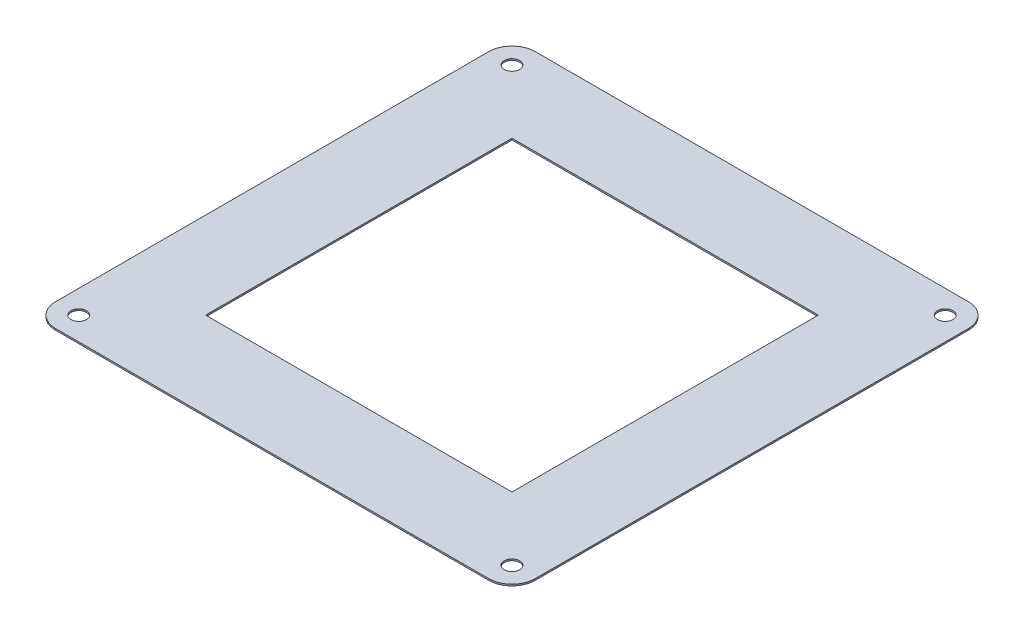
ISO-10303-21;
HEADER;
FILE_DESCRIPTION(('STEP AP214'),'2;1');
FILE_NAME('part.step','',(''),(''),'','','');
FILE_SCHEMA(('AUTOMOTIVE_DESIGN { 1 0 10303 214 1 1 1 1 }'));
ENDSEC;
DATA;
#1=APPLICATION_CONTEXT('core data for automotive mechanical design processes');
#2=APPLICATION_PROTOCOL_DEFINITION('international standard','automotive_design',2000,#1);
#3=PRODUCT_CONTEXT('',#1,'mechanical');
#4=PRODUCT('Part','Part','',(#3));
#5=PRODUCT_RELATED_PRODUCT_CATEGORY('part','',(#4));
#6=PRODUCT_DEFINITION_FORMATION('','',#4);
#7=PRODUCT_DEFINITION_CONTEXT('part definition',#1,'design');
#8=PRODUCT_DEFINITION('design','',#6,#7);
#9=PRODUCT_DEFINITION_SHAPE('','',#8);
#10=(LENGTH_UNIT() NAMED_UNIT(*) SI_UNIT(.MILLI.,.METRE.));
#11=(NAMED_UNIT(*) PLANE_ANGLE_UNIT() SI_UNIT($,.RADIAN.));
#12=(NAMED_UNIT(*) SI_UNIT($,.STERADIAN.) SOLID_ANGLE_UNIT());
#13=UNCERTAINTY_MEASURE_WITH_UNIT(LENGTH_MEASURE(1.E-05),#10,'distance_accuracy_value','');
#14=(GEOMETRIC_REPRESENTATION_CONTEXT(3) GLOBAL_UNCERTAINTY_ASSIGNED_CONTEXT((#13)) GLOBAL_UNIT_ASSIGNED_CONTEXT((#10,
#11,#12)) REPRESENTATION_CONTEXT('',''));
#15=CARTESIAN_POINT('',(0.,0.,0.));
#16=DIRECTION('',(0.,0.,1.));
#17=DIRECTION('',(1.,0.,0.));
#18=AXIS2_PLACEMENT_3D('',#15,#16,#17);
#19=CARTESIAN_POINT('',(17.5,0.5,-157.5));
#20=DIRECTION('',(0.,1.,0.));
#21=DIRECTION('',(0.,0.,1.));
#22=AXIS2_PLACEMENT_3D('',#19,#20,#21);
#23=PLANE('',#22);
#24=DIRECTION('',(0.,0.,-1.));
#25=VECTOR('',#24,1.);
#26=CARTESIAN_POINT('',(137.,0.5,-38.));
#27=LINE('',#26,#25);
#28=CARTESIAN_POINT('',(137.,0.5,-38.));
#29=VERTEX_POINT('',#28);
#30=CARTESIAN_POINT('',(137.,0.5,-137.));
#31=VERTEX_POINT('',#30);
#32=EDGE_CURVE('E47',#29,#31,#27,.T.);
#33=ORIENTED_EDGE('',*,*,#32,.F.);
#34=DIRECTION('',(1.,0.,0.));
#35=VECTOR('',#34,1.);
#36=CARTESIAN_POINT('',(38.,0.5,-38.));
#37=LINE('',#36,#35);
#38=CARTESIAN_POINT('',(38.,0.5,-38.));
#39=VERTEX_POINT('',#38);
#40=EDGE_CURVE('E139',#39,#29,#37,.T.);
#41=ORIENTED_EDGE('',*,*,#40,.F.);
#42=DIRECTION('',(0.,0.,1.));
#43=VECTOR('',#42,1.);
#44=CARTESIAN_POINT('',(38.,0.5,-38.));
#45=LINE('',#44,#43);
#46=CARTESIAN_POINT('',(38.,0.5,-137.));
#47=VERTEX_POINT('',#46);
#48=EDGE_CURVE('E124',#47,#39,#45,.T.);
#49=ORIENTED_EDGE('',*,*,#48,.F.);
#50=DIRECTION('',(-1.,0.,0.));
#51=VECTOR('',#50,1.);
#52=CARTESIAN_POINT('',(38.,0.5,-137.));
#53=LINE('',#52,#51);
#54=EDGE_CURVE('E133',#31,#47,#53,.T.);
#55=ORIENTED_EDGE('',*,*,#54,.F.);
#56=EDGE_LOOP('',(#33,#41,#49,#55));
#57=FACE_BOUND('',#56,.T.);
#58=CARTESIAN_POINT('',(157.5,0.5,-17.5));
#59=DIRECTION('',(0.,1.,0.));
#60=DIRECTION('',(0.,0.,1.));
#61=AXIS2_PLACEMENT_3D('',#58,#59,#60);
#62=CIRCLE('',#61,2.5);
#63=CARTESIAN_POINT('',(157.5,0.5,-15.));
#64=VERTEX_POINT('',#63);
#65=EDGE_CURVE('E155',#64,#64,#62,.T.);
#66=ORIENTED_EDGE('',*,*,#65,.F.);
#67=EDGE_LOOP('',(#66));
#68=FACE_BOUND('',#67,.T.);
#69=CARTESIAN_POINT('',(17.5,0.5,-157.5));
#70=DIRECTION('',(0.,1.,0.));
#71=DIRECTION('',(0.,0.,1.));
#72=AXIS2_PLACEMENT_3D('',#69,#70,#71);
#73=CIRCLE('',#72,2.5);
#74=CARTESIAN_POINT('',(17.5,0.5,-155.));
#75=VERTEX_POINT('',#74);
#76=EDGE_CURVE('E167',#75,#75,#73,.T.);
#77=ORIENTED_EDGE('',*,*,#76,.F.);
#78=EDGE_LOOP('',(#77));
#79=FACE_BOUND('',#78,.T.);
#80=CARTESIAN_POINT('',(17.5,0.5,-157.5));
#81=DIRECTION('',(0.,1.,0.));
#82=DIRECTION('',(0.,0.,1.));
#83=AXIS2_PLACEMENT_3D('',#80,#81,#82);
#84=CIRCLE('',#83,7.5);
#85=CARTESIAN_POINT('',(17.5,0.5,-165.));
#86=VERTEX_POINT('',#85);
#87=CARTESIAN_POINT('',(10.,0.5,-157.5));
#88=VERTEX_POINT('',#87);
#89=EDGE_CURVE('E173',#86,#88,#84,.T.);
#90=ORIENTED_EDGE('',*,*,#89,.T.);
#91=DIRECTION('',(0.,0.,1.));
#92=VECTOR('',#91,1.);
#93=CARTESIAN_POINT('',(10.,0.5,-17.5));
#94=LINE('',#93,#92);
#95=CARTESIAN_POINT('',(10.,0.5,-17.5));
#96=VERTEX_POINT('',#95);
#97=EDGE_CURVE('E176',#88,#96,#94,.T.);
#98=ORIENTED_EDGE('',*,*,#97,.T.);
#99=CARTESIAN_POINT('',(17.5,0.5,-17.5));
#100=DIRECTION('',(0.,1.,0.));
#101=DIRECTION('',(0.,0.,1.));
#102=AXIS2_PLACEMENT_3D('',#99,#100,#101);
#103=CIRCLE('',#102,7.5);
#104=CARTESIAN_POINT('',(17.5,0.5,-10.));
#105=VERTEX_POINT('',#104);
#106=EDGE_CURVE('E179',#96,#105,#103,.T.);
#107=ORIENTED_EDGE('',*,*,#106,.T.);
#108=DIRECTION('',(1.,0.,0.));
#109=VECTOR('',#108,1.);
#110=CARTESIAN_POINT('',(17.5,0.5,-10.));
#111=LINE('',#110,#109);
#112=CARTESIAN_POINT('',(157.5,0.5,-9.99999999999999));
#113=VERTEX_POINT('',#112);
#114=EDGE_CURVE('E181',#105,#113,#111,.T.);
#115=ORIENTED_EDGE('',*,*,#114,.T.);
#116=CARTESIAN_POINT('',(157.5,0.5,-17.5));
#117=DIRECTION('',(0.,1.,0.));
#118=DIRECTION('',(0.,0.,1.));
#119=AXIS2_PLACEMENT_3D('',#116,#117,#118);
#120=CIRCLE('',#119,7.50000000000002);
#121=CARTESIAN_POINT('',(165.,0.5,-17.5));
#122=VERTEX_POINT('',#121);
#123=EDGE_CURVE('E183',#113,#122,#120,.T.);
#124=ORIENTED_EDGE('',*,*,#123,.T.);
#125=DIRECTION('',(0.,0.,-1.));
#126=VECTOR('',#125,1.);
#127=CARTESIAN_POINT('',(165.,0.5,-17.5));
#128=LINE('',#127,#126);
#129=CARTESIAN_POINT('',(165.,0.5,-157.5));
#130=VERTEX_POINT('',#129);
#131=EDGE_CURVE('E185',#122,#130,#128,.T.);
#132=ORIENTED_EDGE('',*,*,#131,.T.);
#133=CARTESIAN_POINT('',(157.5,0.5,-157.5));
#134=DIRECTION('',(0.,1.,0.));
#135=DIRECTION('',(0.,0.,1.));
#136=AXIS2_PLACEMENT_3D('',#133,#134,#135);
#137=CIRCLE('',#136,7.50000000000001);
#138=CARTESIAN_POINT('',(157.5,0.5,-165.));
#139=VERTEX_POINT('',#138);
#140=EDGE_CURVE('E187',#130,#139,#137,.T.);
#141=ORIENTED_EDGE('',*,*,#140,.T.);
#142=DIRECTION('',(-1.,0.,0.));
#143=VECTOR('',#142,1.);
#144=CARTESIAN_POINT('',(17.5,0.5,-165.));
#145=LINE('',#144,#143);
#146=EDGE_CURVE('E189',#139,#86,#145,.T.);
#147=ORIENTED_EDGE('',*,*,#146,.T.);
#148=EDGE_LOOP('',(#90,#98,#107,#115,#124,#132,#141,#147));
#149=FACE_BOUND('',#148,.T.);
#150=CARTESIAN_POINT('',(157.5,0.5,-157.5));
#151=DIRECTION('',(0.,1.,0.));
#152=DIRECTION('',(0.,0.,1.));
#153=AXIS2_PLACEMENT_3D('',#150,#151,#152);
#154=CIRCLE('',#153,2.5);
#155=CARTESIAN_POINT('',(157.5,0.5,-155.));
#156=VERTEX_POINT('',#155);
#157=EDGE_CURVE('E161',#156,#156,#154,.T.);
#158=ORIENTED_EDGE('',*,*,#157,.F.);
#159=EDGE_LOOP('',(#158));
#160=FACE_BOUND('',#159,.T.);
#161=CARTESIAN_POINT('',(17.5,0.5,-17.5));
#162=DIRECTION('',(0.,1.,0.));
#163=DIRECTION('',(0.,0.,1.));
#164=AXIS2_PLACEMENT_3D('',#161,#162,#163);
#165=CIRCLE('',#164,2.5);
#166=CARTESIAN_POINT('',(17.5,0.5,-15.));
#167=VERTEX_POINT('',#166);
#168=EDGE_CURVE('E149',#167,#167,#165,.T.);
#169=ORIENTED_EDGE('',*,*,#168,.F.);
#170=EDGE_LOOP('',(#169));
#171=FACE_BOUND('',#170,.T.);
#172=ADVANCED_FACE('F32',(#57,#68,#79,#149,#160,#171),#23,.T.);
#173=CARTESIAN_POINT('',(17.5,0.,-157.5));
#174=DIRECTION('',(0.,1.,0.));
#175=DIRECTION('',(0.,0.,1.));
#176=AXIS2_PLACEMENT_3D('',#173,#174,#175);
#177=PLANE('',#176);
#178=DIRECTION('',(1.,0.,0.));
#179=VECTOR('',#178,1.);
#180=CARTESIAN_POINT('',(17.5,0.,-38.));
#181=LINE('',#180,#179);
#182=CARTESIAN_POINT('',(38.,0.,-38.));
#183=VERTEX_POINT('',#182);
#184=CARTESIAN_POINT('',(137.,0.,-38.));
#185=VERTEX_POINT('',#184);
#186=EDGE_CURVE('E40',#183,#185,#181,.T.);
#187=ORIENTED_EDGE('',*,*,#186,.T.);
#188=DIRECTION('',(0.,0.,-1.));
#189=VECTOR('',#188,1.);
#190=CARTESIAN_POINT('',(137.,0.,-157.5));
#191=LINE('',#190,#189);
#192=CARTESIAN_POINT('',(137.,0.,-137.));
#193=VERTEX_POINT('',#192);
#194=EDGE_CURVE('E11',#185,#193,#191,.T.);
#195=ORIENTED_EDGE('',*,*,#194,.T.);
#196=DIRECTION('',(-1.,0.,0.));
#197=VECTOR('',#196,1.);
#198=CARTESIAN_POINT('',(17.5,0.,-137.));
#199=LINE('',#198,#197);
#200=CARTESIAN_POINT('',(38.,0.,-137.));
#201=VERTEX_POINT('',#200);
#202=EDGE_CURVE('E230',#193,#201,#199,.T.);
#203=ORIENTED_EDGE('',*,*,#202,.T.);
#204=DIRECTION('',(0.,0.,1.));
#205=VECTOR('',#204,1.);
#206=CARTESIAN_POINT('',(38.,0.,-157.5));
#207=LINE('',#206,#205);
#208=EDGE_CURVE('E127',#201,#183,#207,.T.);
#209=ORIENTED_EDGE('',*,*,#208,.T.);
#210=EDGE_LOOP('',(#187,#195,#203,#209));
#211=FACE_BOUND('',#210,.T.);
#212=CARTESIAN_POINT('',(17.5,0.,-157.5));
#213=DIRECTION('',(0.,1.,0.));
#214=DIRECTION('',(0.,0.,1.));
#215=AXIS2_PLACEMENT_3D('',#212,#213,#214);
#216=CIRCLE('',#215,7.5);
#217=CARTESIAN_POINT('',(17.5,0.,-165.));
#218=VERTEX_POINT('',#217);
#219=CARTESIAN_POINT('',(10.,0.,-157.5));
#220=VERTEX_POINT('',#219);
#221=EDGE_CURVE('E170',#218,#220,#216,.T.);
#222=ORIENTED_EDGE('',*,*,#221,.F.);
#223=DIRECTION('',(-1.,0.,0.));
#224=VECTOR('',#223,1.);
#225=CARTESIAN_POINT('',(17.5,0.,-165.));
#226=LINE('',#225,#224);
#227=CARTESIAN_POINT('',(157.5,0.,-165.));
#228=VERTEX_POINT('',#227);
#229=EDGE_CURVE('E177',#228,#218,#226,.T.);
#230=ORIENTED_EDGE('',*,*,#229,.F.);
#231=CARTESIAN_POINT('',(157.5,0.,-157.5));
#232=DIRECTION('',(0.,1.,0.));
#233=DIRECTION('',(0.,0.,1.));
#234=AXIS2_PLACEMENT_3D('',#231,#232,#233);
#235=CIRCLE('',#234,7.50000000000001);
#236=CARTESIAN_POINT('',(165.,0.,-157.5));
#237=VERTEX_POINT('',#236);
#238=EDGE_CURVE('E204',#237,#228,#235,.T.);
#239=ORIENTED_EDGE('',*,*,#238,.F.);
#240=DIRECTION('',(0.,0.,-1.));
#241=VECTOR('',#240,1.);
#242=CARTESIAN_POINT('',(165.,0.,-17.5));
#243=LINE('',#242,#241);
#244=CARTESIAN_POINT('',(165.,0.,-17.5));
#245=VERTEX_POINT('',#244);
#246=EDGE_CURVE('E202',#245,#237,#243,.T.);
#247=ORIENTED_EDGE('',*,*,#246,.F.);
#248=CARTESIAN_POINT('',(157.5,0.,-17.5));
#249=DIRECTION('',(0.,1.,0.));
#250=DIRECTION('',(0.,0.,1.));
#251=AXIS2_PLACEMENT_3D('',#248,#249,#250);
#252=CIRCLE('',#251,7.50000000000002);
#253=CARTESIAN_POINT('',(157.5,0.,-9.99999999999999));
#254=VERTEX_POINT('',#253);
#255=EDGE_CURVE('E200',#254,#245,#252,.T.);
#256=ORIENTED_EDGE('',*,*,#255,.F.);
#257=DIRECTION('',(1.,0.,0.));
#258=VECTOR('',#257,1.);
#259=CARTESIAN_POINT('',(17.5,0.,-10.));
#260=LINE('',#259,#258);
#261=CARTESIAN_POINT('',(17.5,0.,-10.));
#262=VERTEX_POINT('',#261);
#263=EDGE_CURVE('E198',#262,#254,#260,.T.);
#264=ORIENTED_EDGE('',*,*,#263,.F.);
#265=CARTESIAN_POINT('',(17.5,0.,-17.5));
#266=DIRECTION('',(0.,1.,0.));
#267=DIRECTION('',(0.,0.,1.));
#268=AXIS2_PLACEMENT_3D('',#265,#266,#267);
#269=CIRCLE('',#268,7.5);
#270=CARTESIAN_POINT('',(10.,0.,-17.5));
#271=VERTEX_POINT('',#270);
#272=EDGE_CURVE('E196',#271,#262,#269,.T.);
#273=ORIENTED_EDGE('',*,*,#272,.F.);
#274=DIRECTION('',(0.,0.,1.));
#275=VECTOR('',#274,1.);
#276=CARTESIAN_POINT('',(10.,0.,-17.5));
#277=LINE('',#276,#275);
#278=EDGE_CURVE('E194',#220,#271,#277,.T.);
#279=ORIENTED_EDGE('',*,*,#278,.F.);
#280=EDGE_LOOP('',(#222,#230,#239,#247,#256,#264,#273,#279));
#281=FACE_BOUND('',#280,.T.);
#282=CARTESIAN_POINT('',(17.5,0.,-157.5));
#283=DIRECTION('',(0.,1.,0.));
#284=DIRECTION('',(0.,0.,1.));
#285=AXIS2_PLACEMENT_3D('',#282,#283,#284);
#286=CIRCLE('',#285,2.5);
#287=CARTESIAN_POINT('',(17.5,0.,-155.));
#288=VERTEX_POINT('',#287);
#289=EDGE_CURVE('E164',#288,#288,#286,.T.);
#290=ORIENTED_EDGE('',*,*,#289,.T.);
#291=EDGE_LOOP('',(#290));
#292=FACE_BOUND('',#291,.T.);
#293=CARTESIAN_POINT('',(157.5,0.,-157.5));
#294=DIRECTION('',(0.,1.,0.));
#295=DIRECTION('',(0.,0.,1.));
#296=AXIS2_PLACEMENT_3D('',#293,#294,#295);
#297=CIRCLE('',#296,2.5);
#298=CARTESIAN_POINT('',(157.5,0.,-155.));
#299=VERTEX_POINT('',#298);
#300=EDGE_CURVE('E158',#299,#299,#297,.T.);
#301=ORIENTED_EDGE('',*,*,#300,.T.);
#302=EDGE_LOOP('',(#301));
#303=FACE_BOUND('',#302,.T.);
#304=CARTESIAN_POINT('',(157.5,0.,-17.5));
#305=DIRECTION('',(0.,1.,0.));
#306=DIRECTION('',(0.,0.,1.));
#307=AXIS2_PLACEMENT_3D('',#304,#305,#306);
#308=CIRCLE('',#307,2.5);
#309=CARTESIAN_POINT('',(157.5,0.,-15.));
#310=VERTEX_POINT('',#309);
#311=EDGE_CURVE('E152',#310,#310,#308,.T.);
#312=ORIENTED_EDGE('',*,*,#311,.T.);
#313=EDGE_LOOP('',(#312));
#314=FACE_BOUND('',#313,.T.);
#315=CARTESIAN_POINT('',(17.5,0.,-17.5));
#316=DIRECTION('',(0.,1.,0.));
#317=DIRECTION('',(0.,0.,1.));
#318=AXIS2_PLACEMENT_3D('',#315,#316,#317);
#319=CIRCLE('',#318,2.5);
#320=CARTESIAN_POINT('',(17.5,0.,-15.));
#321=VERTEX_POINT('',#320);
#322=EDGE_CURVE('E146',#321,#321,#319,.T.);
#323=ORIENTED_EDGE('',*,*,#322,.T.);
#324=EDGE_LOOP('',(#323));
#325=FACE_BOUND('',#324,.T.);
#326=ADVANCED_FACE('F234',(#211,#281,#292,#303,#314,#325),#177,.F.);
#327=CARTESIAN_POINT('',(17.5,0.5,-157.5));
#328=DIRECTION('',(0.,-1.,0.));
#329=DIRECTION('',(0.,0.,-1.));
#330=AXIS2_PLACEMENT_3D('',#327,#328,#329);
#331=CYLINDRICAL_SURFACE('',#330,7.5);
#332=ORIENTED_EDGE('',*,*,#221,.T.);
#333=DIRECTION('',(0.,-1.,0.));
#334=VECTOR('',#333,1.);
#335=CARTESIAN_POINT('',(10.,0.5,-157.5));
#336=LINE('',#335,#334);
#337=EDGE_CURVE('E227',#88,#220,#336,.T.);
#338=ORIENTED_EDGE('',*,*,#337,.F.);
#339=ORIENTED_EDGE('',*,*,#89,.F.);
#340=DIRECTION('',(0.,-1.,0.));
#341=VECTOR('',#340,1.);
#342=CARTESIAN_POINT('',(17.5,0.5,-165.));
#343=LINE('',#342,#341);
#344=EDGE_CURVE('E191',#86,#218,#343,.T.);
#345=ORIENTED_EDGE('',*,*,#344,.T.);
#346=EDGE_LOOP('',(#332,#338,#339,#345));
#347=FACE_BOUND('',#346,.T.);
#348=ADVANCED_FACE('F34',(#347),#331,.T.);
#349=CARTESIAN_POINT('',(10.,0.5,-17.5));
#350=DIRECTION('',(1.,0.,0.));
#351=DIRECTION('',(0.,0.,-1.));
#352=AXIS2_PLACEMENT_3D('',#349,#350,#351);
#353=PLANE('',#352);
#354=ORIENTED_EDGE('',*,*,#278,.T.);
#355=DIRECTION('',(0.,-1.,0.));
#356=VECTOR('',#355,1.);
#357=CARTESIAN_POINT('',(10.,0.5,-17.5));
#358=LINE('',#357,#356);
#359=EDGE_CURVE('E224',#96,#271,#358,.T.);
#360=ORIENTED_EDGE('',*,*,#359,.F.);
#361=ORIENTED_EDGE('',*,*,#97,.F.);
#362=ORIENTED_EDGE('',*,*,#337,.T.);
#363=EDGE_LOOP('',(#354,#360,#361,#362));
#364=FACE_BOUND('',#363,.T.);
#365=ADVANCED_FACE('F284',(#364),#353,.F.);
#366=CARTESIAN_POINT('',(17.5,0.5,-17.5));
#367=DIRECTION('',(0.,-1.,0.));
#368=DIRECTION('',(0.,0.,-1.));
#369=AXIS2_PLACEMENT_3D('',#366,#367,#368);
#370=CYLINDRICAL_SURFACE('',#369,7.5);
#371=ORIENTED_EDGE('',*,*,#272,.T.);
#372=DIRECTION('',(0.,-1.,0.));
#373=VECTOR('',#372,1.);
#374=CARTESIAN_POINT('',(17.5,0.5,-10.));
#375=LINE('',#374,#373);
#376=EDGE_CURVE('E221',#105,#262,#375,.T.);
#377=ORIENTED_EDGE('',*,*,#376,.F.);
#378=ORIENTED_EDGE('',*,*,#106,.F.);
#379=ORIENTED_EDGE('',*,*,#359,.T.);
#380=EDGE_LOOP('',(#371,#377,#378,#379));
#381=FACE_BOUND('',#380,.T.);
#382=ADVANCED_FACE('F281',(#381),#370,.T.);
#383=CARTESIAN_POINT('',(17.5,0.5,-10.));
#384=DIRECTION('',(0.,0.,-1.));
#385=DIRECTION('',(-1.,0.,0.));
#386=AXIS2_PLACEMENT_3D('',#383,#384,#385);
#387=PLANE('',#386);
#388=ORIENTED_EDGE('',*,*,#263,.T.);
#389=DIRECTION('',(0.,-1.,0.));
#390=VECTOR('',#389,1.);
#391=CARTESIAN_POINT('',(157.5,0.5,-9.99999999999999));
#392=LINE('',#391,#390);
#393=EDGE_CURVE('E218',#113,#254,#392,.T.);
#394=ORIENTED_EDGE('',*,*,#393,.F.);
#395=ORIENTED_EDGE('',*,*,#114,.F.);
#396=ORIENTED_EDGE('',*,*,#376,.T.);
#397=EDGE_LOOP('',(#388,#394,#395,#396));
#398=FACE_BOUND('',#397,.T.);
#399=ADVANCED_FACE('F277',(#398),#387,.F.);
#400=CARTESIAN_POINT('',(157.5,0.5,-17.5));
#401=DIRECTION('',(0.,-1.,0.));
#402=DIRECTION('',(0.,0.,-1.));
#403=AXIS2_PLACEMENT_3D('',#400,#401,#402);
#404=CYLINDRICAL_SURFACE('',#403,7.50000000000002);
#405=ORIENTED_EDGE('',*,*,#255,.T.);
#406=DIRECTION('',(0.,-1.,0.));
#407=VECTOR('',#406,1.);
#408=CARTESIAN_POINT('',(165.,0.5,-17.5));
#409=LINE('',#408,#407);
#410=EDGE_CURVE('E215',#122,#245,#409,.T.);
#411=ORIENTED_EDGE('',*,*,#410,.F.);
#412=ORIENTED_EDGE('',*,*,#123,.F.);
#413=ORIENTED_EDGE('',*,*,#393,.T.);
#414=EDGE_LOOP('',(#405,#411,#412,#413));
#415=FACE_BOUND('',#414,.T.);
#416=ADVANCED_FACE('F273',(#415),#404,.T.);
#417=CARTESIAN_POINT('',(165.,0.5,-17.5));
#418=DIRECTION('',(-1.,0.,0.));
#419=DIRECTION('',(0.,0.,1.));
#420=AXIS2_PLACEMENT_3D('',#417,#418,#419);
#421=PLANE('',#420);
#422=ORIENTED_EDGE('',*,*,#246,.T.);
#423=DIRECTION('',(0.,-1.,0.));
#424=VECTOR('',#423,1.);
#425=CARTESIAN_POINT('',(165.,0.5,-157.5));
#426=LINE('',#425,#424);
#427=EDGE_CURVE('E212',#130,#237,#426,.T.);
#428=ORIENTED_EDGE('',*,*,#427,.F.);
#429=ORIENTED_EDGE('',*,*,#131,.F.);
#430=ORIENTED_EDGE('',*,*,#410,.T.);
#431=EDGE_LOOP('',(#422,#428,#429,#430));
#432=FACE_BOUND('',#431,.T.);
#433=ADVANCED_FACE('F269',(#432),#421,.F.);
#434=CARTESIAN_POINT('',(157.5,0.5,-157.5));
#435=DIRECTION('',(0.,-1.,0.));
#436=DIRECTION('',(0.,0.,-1.));
#437=AXIS2_PLACEMENT_3D('',#434,#435,#436);
#438=CYLINDRICAL_SURFACE('',#437,7.50000000000001);
#439=ORIENTED_EDGE('',*,*,#238,.T.);
#440=DIRECTION('',(0.,-1.,0.));
#441=VECTOR('',#440,1.);
#442=CARTESIAN_POINT('',(157.5,0.5,-165.));
#443=LINE('',#442,#441);
#444=EDGE_CURVE('E209',#139,#228,#443,.T.);
#445=ORIENTED_EDGE('',*,*,#444,.F.);
#446=ORIENTED_EDGE('',*,*,#140,.F.);
#447=ORIENTED_EDGE('',*,*,#427,.T.);
#448=EDGE_LOOP('',(#439,#445,#446,#447));
#449=FACE_BOUND('',#448,.T.);
#450=ADVANCED_FACE('F265',(#449),#438,.T.);
#451=CARTESIAN_POINT('',(17.5,0.5,-165.));
#452=DIRECTION('',(0.,0.,1.));
#453=DIRECTION('',(1.,0.,0.));
#454=AXIS2_PLACEMENT_3D('',#451,#452,#453);
#455=PLANE('',#454);
#456=ORIENTED_EDGE('',*,*,#229,.T.);
#457=ORIENTED_EDGE('',*,*,#344,.F.);
#458=ORIENTED_EDGE('',*,*,#146,.F.);
#459=ORIENTED_EDGE('',*,*,#444,.T.);
#460=EDGE_LOOP('',(#456,#457,#458,#459));
#461=FACE_BOUND('',#460,.T.);
#462=ADVANCED_FACE('F262',(#461),#455,.F.);
#463=CARTESIAN_POINT('',(17.5,0.5,-157.5));
#464=DIRECTION('',(0.,-1.,0.));
#465=DIRECTION('',(0.,0.,-1.));
#466=AXIS2_PLACEMENT_3D('',#463,#464,#465);
#467=CYLINDRICAL_SURFACE('',#466,2.5);
#468=ORIENTED_EDGE('',*,*,#76,.T.);
#469=EDGE_LOOP('',(#468));
#470=FACE_BOUND('',#469,.T.);
#471=ORIENTED_EDGE('',*,*,#289,.F.);
#472=EDGE_LOOP('',(#471));
#473=FACE_BOUND('',#472,.T.);
#474=ADVANCED_FACE('F259',(#470,#473),#467,.F.);
#475=CARTESIAN_POINT('',(157.5,0.5,-157.5));
#476=DIRECTION('',(0.,-1.,0.));
#477=DIRECTION('',(0.,0.,-1.));
#478=AXIS2_PLACEMENT_3D('',#475,#476,#477);
#479=CYLINDRICAL_SURFACE('',#478,2.5);
#480=ORIENTED_EDGE('',*,*,#157,.T.);
#481=EDGE_LOOP('',(#480));
#482=FACE_BOUND('',#481,.T.);
#483=ORIENTED_EDGE('',*,*,#300,.F.);
#484=EDGE_LOOP('',(#483));
#485=FACE_BOUND('',#484,.T.);
#486=ADVANCED_FACE('F324',(#482,#485),#479,.F.);
#487=CARTESIAN_POINT('',(157.5,0.5,-17.5));
#488=DIRECTION('',(0.,-1.,0.));
#489=DIRECTION('',(0.,0.,-1.));
#490=AXIS2_PLACEMENT_3D('',#487,#488,#489);
#491=CYLINDRICAL_SURFACE('',#490,2.5);
#492=ORIENTED_EDGE('',*,*,#65,.T.);
#493=EDGE_LOOP('',(#492));
#494=FACE_BOUND('',#493,.T.);
#495=ORIENTED_EDGE('',*,*,#311,.F.);
#496=EDGE_LOOP('',(#495));
#497=FACE_BOUND('',#496,.T.);
#498=ADVANCED_FACE('F248',(#494,#497),#491,.F.);
#499=CARTESIAN_POINT('',(17.5,0.5,-17.5));
#500=DIRECTION('',(0.,-1.,0.));
#501=DIRECTION('',(0.,0.,-1.));
#502=AXIS2_PLACEMENT_3D('',#499,#500,#501);
#503=CYLINDRICAL_SURFACE('',#502,2.5);
#504=ORIENTED_EDGE('',*,*,#168,.T.);
#505=EDGE_LOOP('',(#504));
#506=FACE_BOUND('',#505,.T.);
#507=ORIENTED_EDGE('',*,*,#322,.F.);
#508=EDGE_LOOP('',(#507));
#509=FACE_BOUND('',#508,.T.);
#510=ADVANCED_FACE('F241',(#506,#509),#503,.F.);
#511=CARTESIAN_POINT('',(137.,-9.5,-38.));
#512=DIRECTION('',(1.,0.,0.));
#513=DIRECTION('',(0.,0.,-1.));
#514=AXIS2_PLACEMENT_3D('',#511,#512,#513);
#515=PLANE('',#514);
#516=DIRECTION('',(0.,1.,0.));
#517=VECTOR('',#516,1.);
#518=CARTESIAN_POINT('',(137.,-9.5,-38.));
#519=LINE('',#518,#517);
#520=EDGE_CURVE('E144',#185,#29,#519,.T.);
#521=ORIENTED_EDGE('',*,*,#520,.T.);
#522=ORIENTED_EDGE('',*,*,#32,.T.);
#523=DIRECTION('',(0.,1.,0.));
#524=VECTOR('',#523,1.);
#525=CARTESIAN_POINT('',(137.,-9.5,-137.));
#526=LINE('',#525,#524);
#527=EDGE_CURVE('E130',#193,#31,#526,.T.);
#528=ORIENTED_EDGE('',*,*,#527,.F.);
#529=ORIENTED_EDGE('',*,*,#194,.F.);
#530=EDGE_LOOP('',(#521,#522,#528,#529));
#531=FACE_BOUND('',#530,.T.);
#532=ADVANCED_FACE('F239',(#531),#515,.F.);
#533=CARTESIAN_POINT('',(38.,-9.5,-38.));
#534=DIRECTION('',(0.,0.,1.));
#535=DIRECTION('',(1.,0.,0.));
#536=AXIS2_PLACEMENT_3D('',#533,#534,#535);
#537=PLANE('',#536);
#538=DIRECTION('',(0.,1.,0.));
#539=VECTOR('',#538,1.);
#540=CARTESIAN_POINT('',(38.,-9.5,-38.));
#541=LINE('',#540,#539);
#542=EDGE_CURVE('E129',#183,#39,#541,.T.);
#543=ORIENTED_EDGE('',*,*,#542,.T.);
#544=ORIENTED_EDGE('',*,*,#40,.T.);
#545=ORIENTED_EDGE('',*,*,#520,.F.);
#546=ORIENTED_EDGE('',*,*,#186,.F.);
#547=EDGE_LOOP('',(#543,#544,#545,#546));
#548=FACE_BOUND('',#547,.T.);
#549=ADVANCED_FACE('F238',(#548),#537,.F.);
#550=CARTESIAN_POINT('',(38.,-9.5,-38.));
#551=DIRECTION('',(-1.,0.,0.));
#552=DIRECTION('',(0.,0.,1.));
#553=AXIS2_PLACEMENT_3D('',#550,#551,#552);
#554=PLANE('',#553);
#555=DIRECTION('',(0.,1.,0.));
#556=VECTOR('',#555,1.);
#557=CARTESIAN_POINT('',(38.,-9.5,-137.));
#558=LINE('',#557,#556);
#559=EDGE_CURVE('E55',#201,#47,#558,.T.);
#560=ORIENTED_EDGE('',*,*,#559,.T.);
#561=ORIENTED_EDGE('',*,*,#48,.T.);
#562=ORIENTED_EDGE('',*,*,#542,.F.);
#563=ORIENTED_EDGE('',*,*,#208,.F.);
#564=EDGE_LOOP('',(#560,#561,#562,#563));
#565=FACE_BOUND('',#564,.T.);
#566=ADVANCED_FACE('F121',(#565),#554,.F.);
#567=CARTESIAN_POINT('',(38.,-9.5,-137.));
#568=DIRECTION('',(0.,0.,-1.));
#569=DIRECTION('',(-1.,0.,0.));
#570=AXIS2_PLACEMENT_3D('',#567,#568,#569);
#571=PLANE('',#570);
#572=ORIENTED_EDGE('',*,*,#527,.T.);
#573=ORIENTED_EDGE('',*,*,#54,.T.);
#574=ORIENTED_EDGE('',*,*,#559,.F.);
#575=ORIENTED_EDGE('',*,*,#202,.F.);
#576=EDGE_LOOP('',(#572,#573,#574,#575));
#577=FACE_BOUND('',#576,.T.);
#578=ADVANCED_FACE('F134',(#577),#571,.F.);
#579=CLOSED_SHELL('',(#172,#326,#348,#365,#382,#399,#416,#433,#450,#462,#474,#486,#498,#510,
#532,#549,#566,#578));
#580=MANIFOLD_SOLID_BREP('B2',#579);
#581=ADVANCED_BREP_SHAPE_REPRESENTATION('',(#18,#580),#14);
#582=SHAPE_DEFINITION_REPRESENTATION(#9,#581);
ENDSEC;
END-ISO-10303-21;
